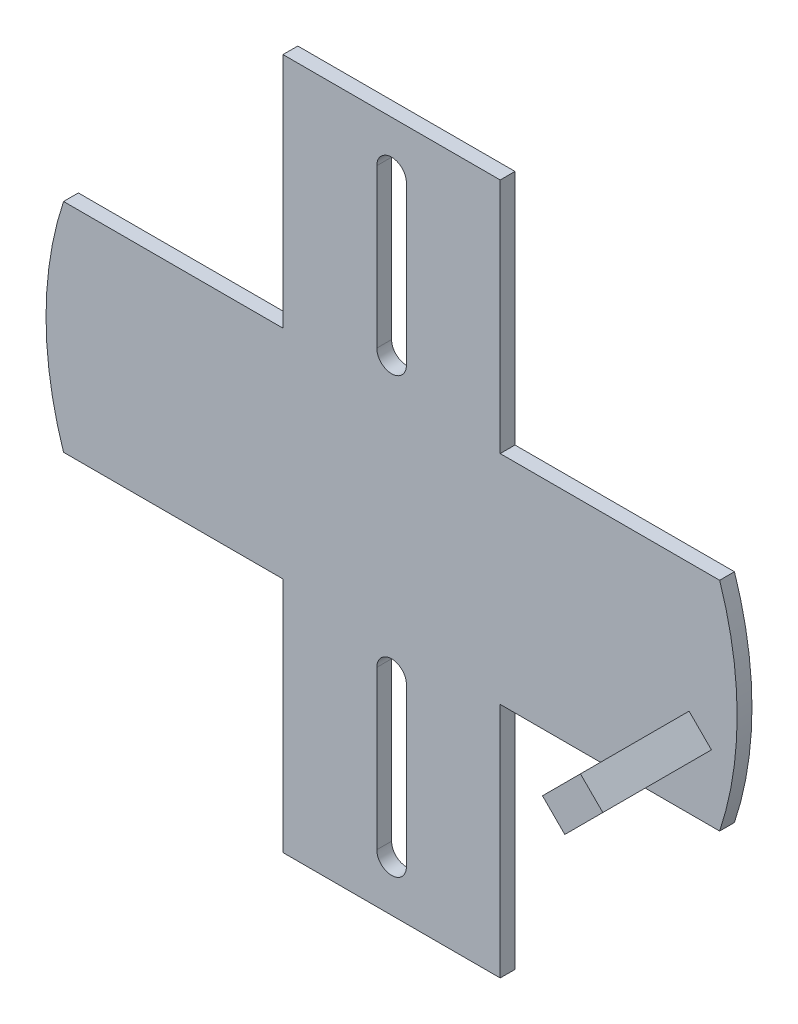
ISO-10303-21;
HEADER;
FILE_DESCRIPTION(('STEP AP214'),'2;1');
FILE_NAME('part.step','',(''),(''),'','','');
FILE_SCHEMA(('AUTOMOTIVE_DESIGN { 1 0 10303 214 1 1 1 1 }'));
ENDSEC;
DATA;
#1=APPLICATION_CONTEXT('core data for automotive mechanical design processes');
#2=APPLICATION_PROTOCOL_DEFINITION('international standard','automotive_design',2000,#1);
#3=PRODUCT_CONTEXT('',#1,'mechanical');
#4=PRODUCT('Part','Part','',(#3));
#5=PRODUCT_RELATED_PRODUCT_CATEGORY('part','',(#4));
#6=PRODUCT_DEFINITION_FORMATION('','',#4);
#7=PRODUCT_DEFINITION_CONTEXT('part definition',#1,'design');
#8=PRODUCT_DEFINITION('design','',#6,#7);
#9=PRODUCT_DEFINITION_SHAPE('','',#8);
#10=(LENGTH_UNIT() NAMED_UNIT(*) SI_UNIT(.MILLI.,.METRE.));
#11=(NAMED_UNIT(*) PLANE_ANGLE_UNIT() SI_UNIT($,.RADIAN.));
#12=(NAMED_UNIT(*) SI_UNIT($,.STERADIAN.) SOLID_ANGLE_UNIT());
#13=UNCERTAINTY_MEASURE_WITH_UNIT(LENGTH_MEASURE(1.E-05),#10,'distance_accuracy_value','');
#14=(GEOMETRIC_REPRESENTATION_CONTEXT(3) GLOBAL_UNCERTAINTY_ASSIGNED_CONTEXT((#13)) GLOBAL_UNIT_ASSIGNED_CONTEXT((#10,
#11,#12)) REPRESENTATION_CONTEXT('',''));
#15=CARTESIAN_POINT('',(0.,0.,0.));
#16=DIRECTION('',(0.,0.,1.));
#17=DIRECTION('',(1.,0.,0.));
#18=AXIS2_PLACEMENT_3D('',#15,#16,#17);
#19=CARTESIAN_POINT('',(0.,-25.,1.5));
#20=DIRECTION('',(0.,0.,-1.));
#21=DIRECTION('',(-1.,0.,0.));
#22=AXIS2_PLACEMENT_3D('',#19,#20,#21);
#23=PLANE('',#22);
#24=CARTESIAN_POINT('',(0.,-39.,1.5));
#25=DIRECTION('',(0.,0.,1.));
#26=DIRECTION('',(1.,0.,0.));
#27=AXIS2_PLACEMENT_3D('',#24,#25,#26);
#28=CIRCLE('',#27,1.5);
#29=CARTESIAN_POINT('',(1.5,-39.,1.5));
#30=VERTEX_POINT('',#29);
#31=CARTESIAN_POINT('',(-1.5,-39.,1.5));
#32=VERTEX_POINT('',#31);
#33=EDGE_CURVE('E224',#30,#32,#28,.T.);
#34=ORIENTED_EDGE('',*,*,#33,.F.);
#35=DIRECTION('',(0.,1.,0.));
#36=VECTOR('',#35,1.);
#37=CARTESIAN_POINT('',(1.5,-39.,1.5));
#38=LINE('',#37,#36);
#39=CARTESIAN_POINT('',(1.5,-55.,1.5));
#40=VERTEX_POINT('',#39);
#41=EDGE_CURVE('E232',#40,#30,#38,.T.);
#42=ORIENTED_EDGE('',*,*,#41,.F.);
#43=CARTESIAN_POINT('',(0.,-55.,1.5));
#44=DIRECTION('',(0.,0.,1.));
#45=DIRECTION('',(1.,0.,0.));
#46=AXIS2_PLACEMENT_3D('',#43,#44,#45);
#47=CIRCLE('',#46,1.5);
#48=CARTESIAN_POINT('',(-1.5,-55.,1.5));
#49=VERTEX_POINT('',#48);
#50=EDGE_CURVE('E229',#49,#40,#47,.T.);
#51=ORIENTED_EDGE('',*,*,#50,.F.);
#52=DIRECTION('',(0.,-1.,0.));
#53=VECTOR('',#52,1.);
#54=CARTESIAN_POINT('',(-1.5,-39.,1.5));
#55=LINE('',#54,#53);
#56=EDGE_CURVE('E226',#32,#49,#55,.T.);
#57=ORIENTED_EDGE('',*,*,#56,.F.);
#58=EDGE_LOOP('',(#34,#42,#51,#57));
#59=FACE_BOUND('',#58,.T.);
#60=DIRECTION('',(0.,-1.,0.));
#61=VECTOR('',#60,1.);
#62=CARTESIAN_POINT('',(-11.,-14.,1.5));
#63=LINE('',#62,#61);
#64=CARTESIAN_POINT('',(-11.,10.,1.5));
#65=VERTEX_POINT('',#64);
#66=CARTESIAN_POINT('',(-11.,-14.,1.5));
#67=VERTEX_POINT('',#66);
#68=EDGE_CURVE('E283',#65,#67,#63,.T.);
#69=ORIENTED_EDGE('',*,*,#68,.T.);
#70=DIRECTION('',(-1.,0.,0.));
#71=VECTOR('',#70,1.);
#72=CARTESIAN_POINT('',(-33.2264954516723,-14.,1.5));
#73=LINE('',#72,#71);
#74=CARTESIAN_POINT('',(-33.2264954516723,-14.,1.5));
#75=VERTEX_POINT('',#74);
#76=EDGE_CURVE('E286',#67,#75,#73,.T.);
#77=ORIENTED_EDGE('',*,*,#76,.T.);
#78=CARTESIAN_POINT('',(0.,-25.,1.5));
#79=DIRECTION('',(0.,0.,1.));
#80=DIRECTION('',(1.,0.,0.));
#81=AXIS2_PLACEMENT_3D('',#78,#79,#80);
#82=CIRCLE('',#81,35.);
#83=CARTESIAN_POINT('',(-33.2264954516723,-36.,1.5));
#84=VERTEX_POINT('',#83);
#85=EDGE_CURVE('E289',#75,#84,#82,.T.);
#86=ORIENTED_EDGE('',*,*,#85,.T.);
#87=DIRECTION('',(1.,0.,0.));
#88=VECTOR('',#87,1.);
#89=CARTESIAN_POINT('',(-11.,-36.,1.5));
#90=LINE('',#89,#88);
#91=CARTESIAN_POINT('',(-11.,-36.,1.5));
#92=VERTEX_POINT('',#91);
#93=EDGE_CURVE('E291',#84,#92,#90,.T.);
#94=ORIENTED_EDGE('',*,*,#93,.T.);
#95=DIRECTION('',(0.,-1.,0.));
#96=VECTOR('',#95,1.);
#97=CARTESIAN_POINT('',(-11.,-60.,1.5));
#98=LINE('',#97,#96);
#99=CARTESIAN_POINT('',(-11.,-60.,1.5));
#100=VERTEX_POINT('',#99);
#101=EDGE_CURVE('E293',#92,#100,#98,.T.);
#102=ORIENTED_EDGE('',*,*,#101,.T.);
#103=DIRECTION('',(1.,0.,0.));
#104=VECTOR('',#103,1.);
#105=CARTESIAN_POINT('',(11.,-60.,1.5));
#106=LINE('',#105,#104);
#107=CARTESIAN_POINT('',(11.,-60.,1.5));
#108=VERTEX_POINT('',#107);
#109=EDGE_CURVE('E295',#100,#108,#106,.T.);
#110=ORIENTED_EDGE('',*,*,#109,.T.);
#111=DIRECTION('',(0.,1.,0.));
#112=VECTOR('',#111,1.);
#113=CARTESIAN_POINT('',(11.,-36.,1.5));
#114=LINE('',#113,#112);
#115=CARTESIAN_POINT('',(11.,-36.,1.5));
#116=VERTEX_POINT('',#115);
#117=EDGE_CURVE('E297',#108,#116,#114,.T.);
#118=ORIENTED_EDGE('',*,*,#117,.T.);
#119=DIRECTION('',(1.,0.,0.));
#120=VECTOR('',#119,1.);
#121=CARTESIAN_POINT('',(33.2264954516723,-36.,1.5));
#122=LINE('',#121,#120);
#123=CARTESIAN_POINT('',(33.2264954516723,-36.,1.5));
#124=VERTEX_POINT('',#123);
#125=EDGE_CURVE('E299',#116,#124,#122,.T.);
#126=ORIENTED_EDGE('',*,*,#125,.T.);
#127=CARTESIAN_POINT('',(0.,-25.,1.5));
#128=DIRECTION('',(0.,0.,1.));
#129=DIRECTION('',(-1.,0.,0.));
#130=AXIS2_PLACEMENT_3D('',#127,#128,#129);
#131=CIRCLE('',#130,35.);
#132=CARTESIAN_POINT('',(33.2264954516723,-14.,1.5));
#133=VERTEX_POINT('',#132);
#134=EDGE_CURVE('E301',#124,#133,#131,.T.);
#135=ORIENTED_EDGE('',*,*,#134,.T.);
#136=DIRECTION('',(-1.,0.,0.));
#137=VECTOR('',#136,1.);
#138=CARTESIAN_POINT('',(11.,-14.,1.5));
#139=LINE('',#138,#137);
#140=CARTESIAN_POINT('',(11.,-14.,1.5));
#141=VERTEX_POINT('',#140);
#142=EDGE_CURVE('E303',#133,#141,#139,.T.);
#143=ORIENTED_EDGE('',*,*,#142,.T.);
#144=DIRECTION('',(0.,1.,0.));
#145=VECTOR('',#144,1.);
#146=CARTESIAN_POINT('',(11.,10.,1.5));
#147=LINE('',#146,#145);
#148=CARTESIAN_POINT('',(11.,10.,1.5));
#149=VERTEX_POINT('',#148);
#150=EDGE_CURVE('E305',#141,#149,#147,.T.);
#151=ORIENTED_EDGE('',*,*,#150,.T.);
#152=DIRECTION('',(-1.,0.,0.));
#153=VECTOR('',#152,1.);
#154=CARTESIAN_POINT('',(-11.,10.,1.5));
#155=LINE('',#154,#153);
#156=EDGE_CURVE('E307',#149,#65,#155,.T.);
#157=ORIENTED_EDGE('',*,*,#156,.T.);
#158=EDGE_LOOP('',(#69,#77,#86,#94,#102,#110,#118,#126,#135,#143,#151,#157));
#159=FACE_BOUND('',#158,.T.);
#160=CARTESIAN_POINT('',(0.,5.,1.5));
#161=DIRECTION('',(0.,0.,1.));
#162=DIRECTION('',(1.,0.,0.));
#163=AXIS2_PLACEMENT_3D('',#160,#161,#162);
#164=CIRCLE('',#163,1.49999999999999);
#165=CARTESIAN_POINT('',(1.49999999999999,5.,1.5));
#166=VERTEX_POINT('',#165);
#167=CARTESIAN_POINT('',(-1.49999999999999,5.,1.5));
#168=VERTEX_POINT('',#167);
#169=EDGE_CURVE('E252',#166,#168,#164,.T.);
#170=ORIENTED_EDGE('',*,*,#169,.F.);
#171=DIRECTION('',(0.,1.,0.));
#172=VECTOR('',#171,1.);
#173=CARTESIAN_POINT('',(1.49999999999999,5.,1.5));
#174=LINE('',#173,#172);
#175=CARTESIAN_POINT('',(1.49999999999999,-11.,1.5));
#176=VERTEX_POINT('',#175);
#177=EDGE_CURVE('E260',#176,#166,#174,.T.);
#178=ORIENTED_EDGE('',*,*,#177,.F.);
#179=CARTESIAN_POINT('',(0.,-11.,1.5));
#180=DIRECTION('',(0.,0.,1.));
#181=DIRECTION('',(1.,0.,0.));
#182=AXIS2_PLACEMENT_3D('',#179,#180,#181);
#183=CIRCLE('',#182,1.49999999999999);
#184=CARTESIAN_POINT('',(-1.5,-11.,1.5));
#185=VERTEX_POINT('',#184);
#186=EDGE_CURVE('E257',#185,#176,#183,.T.);
#187=ORIENTED_EDGE('',*,*,#186,.F.);
#188=DIRECTION('',(0.,-1.,0.));
#189=VECTOR('',#188,1.);
#190=CARTESIAN_POINT('',(-1.49999999999999,5.,1.5));
#191=LINE('',#190,#189);
#192=EDGE_CURVE('E254',#168,#185,#191,.T.);
#193=ORIENTED_EDGE('',*,*,#192,.F.);
#194=EDGE_LOOP('',(#170,#178,#187,#193));
#195=FACE_BOUND('',#194,.T.);
#196=DIRECTION('',(0.707106781186547,-0.707106781186548,0.));
#197=VECTOR('',#196,1.);
#198=CARTESIAN_POINT('',(28.5441644149849,-33.1399505714038,1.5));
#199=LINE('',#198,#197);
#200=CARTESIAN_POINT('',(26.2808853510265,-30.8766715074454,1.5));
#201=VERTEX_POINT('',#200);
#202=CARTESIAN_POINT('',(28.5441644149849,-33.1399505714038,1.5));
#203=VERTEX_POINT('',#202);
#204=EDGE_CURVE('E214',#201,#203,#199,.T.);
#205=ORIENTED_EDGE('',*,*,#204,.F.);
#206=DIRECTION('',(-0.707106781186546,-0.707106781186549,0.));
#207=VECTOR('',#206,1.);
#208=CARTESIAN_POINT('',(26.2808853510265,-30.8766715074454,1.5));
#209=LINE('',#208,#207);
#210=CARTESIAN_POINT('',(30.1295423103398,-27.0280145481321,1.5));
#211=VERTEX_POINT('',#210);
#212=EDGE_CURVE('E211',#211,#201,#209,.T.);
#213=ORIENTED_EDGE('',*,*,#212,.F.);
#214=DIRECTION('',(-0.707106781186549,0.707106781186546,0.));
#215=VECTOR('',#214,1.);
#216=CARTESIAN_POINT('',(32.3928213742982,-29.2912936120904,1.5));
#217=LINE('',#216,#215);
#218=CARTESIAN_POINT('',(32.3928213742982,-29.2912936120904,1.5));
#219=VERTEX_POINT('',#218);
#220=EDGE_CURVE('E53',#219,#211,#217,.T.);
#221=ORIENTED_EDGE('',*,*,#220,.F.);
#222=DIRECTION('',(0.707106781186548,0.707106781186547,0.));
#223=VECTOR('',#222,1.);
#224=CARTESIAN_POINT('',(28.5441644149849,-33.1399505714038,1.5));
#225=LINE('',#224,#223);
#226=EDGE_CURVE('E48',#203,#219,#225,.T.);
#227=ORIENTED_EDGE('',*,*,#226,.F.);
#228=EDGE_LOOP('',(#205,#213,#221,#227));
#229=FACE_BOUND('',#228,.T.);
#230=ADVANCED_FACE('F33',(#59,#159,#195,#229),#23,.F.);
#231=CARTESIAN_POINT('',(0.,-25.,0.));
#232=DIRECTION('',(0.,0.,-1.));
#233=DIRECTION('',(-1.,0.,0.));
#234=AXIS2_PLACEMENT_3D('',#231,#232,#233);
#235=PLANE('',#234);
#236=DIRECTION('',(0.,1.,0.));
#237=VECTOR('',#236,1.);
#238=CARTESIAN_POINT('',(1.49999999999999,5.,0.));
#239=LINE('',#238,#237);
#240=CARTESIAN_POINT('',(1.49999999999999,-11.,0.));
#241=VERTEX_POINT('',#240);
#242=CARTESIAN_POINT('',(1.49999999999999,5.,0.));
#243=VERTEX_POINT('',#242);
#244=EDGE_CURVE('E255',#241,#243,#239,.T.);
#245=ORIENTED_EDGE('',*,*,#244,.T.);
#246=CARTESIAN_POINT('',(0.,5.,0.));
#247=DIRECTION('',(0.,0.,1.));
#248=DIRECTION('',(1.,0.,0.));
#249=AXIS2_PLACEMENT_3D('',#246,#247,#248);
#250=CIRCLE('',#249,1.49999999999999);
#251=CARTESIAN_POINT('',(-1.49999999999999,5.,0.));
#252=VERTEX_POINT('',#251);
#253=EDGE_CURVE('E251',#243,#252,#250,.T.);
#254=ORIENTED_EDGE('',*,*,#253,.T.);
#255=DIRECTION('',(0.,-1.,0.));
#256=VECTOR('',#255,1.);
#257=CARTESIAN_POINT('',(-1.49999999999999,5.,0.));
#258=LINE('',#257,#256);
#259=CARTESIAN_POINT('',(-1.5,-11.,0.));
#260=VERTEX_POINT('',#259);
#261=EDGE_CURVE('E265',#252,#260,#258,.T.);
#262=ORIENTED_EDGE('',*,*,#261,.T.);
#263=CARTESIAN_POINT('',(0.,-11.,0.));
#264=DIRECTION('',(0.,0.,1.));
#265=DIRECTION('',(1.,0.,0.));
#266=AXIS2_PLACEMENT_3D('',#263,#264,#265);
#267=CIRCLE('',#266,1.49999999999999);
#268=EDGE_CURVE('E268',#260,#241,#267,.T.);
#269=ORIENTED_EDGE('',*,*,#268,.T.);
#270=EDGE_LOOP('',(#245,#254,#262,#269));
#271=FACE_BOUND('',#270,.T.);
#272=DIRECTION('',(0.,-1.,0.));
#273=VECTOR('',#272,1.);
#274=CARTESIAN_POINT('',(-11.,-14.,0.));
#275=LINE('',#274,#273);
#276=CARTESIAN_POINT('',(-11.,10.,0.));
#277=VERTEX_POINT('',#276);
#278=CARTESIAN_POINT('',(-11.,-14.,0.));
#279=VERTEX_POINT('',#278);
#280=EDGE_CURVE('E282',#277,#279,#275,.T.);
#281=ORIENTED_EDGE('',*,*,#280,.F.);
#282=DIRECTION('',(-1.,0.,0.));
#283=VECTOR('',#282,1.);
#284=CARTESIAN_POINT('',(-11.,10.,0.));
#285=LINE('',#284,#283);
#286=CARTESIAN_POINT('',(11.,10.,0.));
#287=VERTEX_POINT('',#286);
#288=EDGE_CURVE('E287',#287,#277,#285,.T.);
#289=ORIENTED_EDGE('',*,*,#288,.F.);
#290=DIRECTION('',(0.,1.,0.));
#291=VECTOR('',#290,1.);
#292=CARTESIAN_POINT('',(11.,10.,0.));
#293=LINE('',#292,#291);
#294=CARTESIAN_POINT('',(11.,-14.,0.));
#295=VERTEX_POINT('',#294);
#296=EDGE_CURVE('E330',#295,#287,#293,.T.);
#297=ORIENTED_EDGE('',*,*,#296,.F.);
#298=DIRECTION('',(-1.,0.,0.));
#299=VECTOR('',#298,1.);
#300=CARTESIAN_POINT('',(11.,-14.,0.));
#301=LINE('',#300,#299);
#302=CARTESIAN_POINT('',(33.2264954516723,-14.,0.));
#303=VERTEX_POINT('',#302);
#304=EDGE_CURVE('E328',#303,#295,#301,.T.);
#305=ORIENTED_EDGE('',*,*,#304,.F.);
#306=CARTESIAN_POINT('',(0.,-25.,0.));
#307=DIRECTION('',(0.,0.,1.));
#308=DIRECTION('',(-1.,0.,0.));
#309=AXIS2_PLACEMENT_3D('',#306,#307,#308);
#310=CIRCLE('',#309,35.);
#311=CARTESIAN_POINT('',(33.2264954516723,-36.,0.));
#312=VERTEX_POINT('',#311);
#313=EDGE_CURVE('E326',#312,#303,#310,.T.);
#314=ORIENTED_EDGE('',*,*,#313,.F.);
#315=DIRECTION('',(1.,0.,0.));
#316=VECTOR('',#315,1.);
#317=CARTESIAN_POINT('',(33.2264954516723,-36.,0.));
#318=LINE('',#317,#316);
#319=CARTESIAN_POINT('',(11.,-36.,0.));
#320=VERTEX_POINT('',#319);
#321=EDGE_CURVE('E324',#320,#312,#318,.T.);
#322=ORIENTED_EDGE('',*,*,#321,.F.);
#323=DIRECTION('',(0.,1.,0.));
#324=VECTOR('',#323,1.);
#325=CARTESIAN_POINT('',(11.,-36.,0.));
#326=LINE('',#325,#324);
#327=CARTESIAN_POINT('',(11.,-60.,0.));
#328=VERTEX_POINT('',#327);
#329=EDGE_CURVE('E322',#328,#320,#326,.T.);
#330=ORIENTED_EDGE('',*,*,#329,.F.);
#331=DIRECTION('',(1.,0.,0.));
#332=VECTOR('',#331,1.);
#333=CARTESIAN_POINT('',(11.,-60.,0.));
#334=LINE('',#333,#332);
#335=CARTESIAN_POINT('',(-11.,-60.,0.));
#336=VERTEX_POINT('',#335);
#337=EDGE_CURVE('E320',#336,#328,#334,.T.);
#338=ORIENTED_EDGE('',*,*,#337,.F.);
#339=DIRECTION('',(0.,-1.,0.));
#340=VECTOR('',#339,1.);
#341=CARTESIAN_POINT('',(-11.,-60.,0.));
#342=LINE('',#341,#340);
#343=CARTESIAN_POINT('',(-11.,-36.,0.));
#344=VERTEX_POINT('',#343);
#345=EDGE_CURVE('E318',#344,#336,#342,.T.);
#346=ORIENTED_EDGE('',*,*,#345,.F.);
#347=DIRECTION('',(1.,0.,0.));
#348=VECTOR('',#347,1.);
#349=CARTESIAN_POINT('',(-11.,-36.,0.));
#350=LINE('',#349,#348);
#351=CARTESIAN_POINT('',(-33.2264954516723,-36.,0.));
#352=VERTEX_POINT('',#351);
#353=EDGE_CURVE('E316',#352,#344,#350,.T.);
#354=ORIENTED_EDGE('',*,*,#353,.F.);
#355=CARTESIAN_POINT('',(0.,-25.,0.));
#356=DIRECTION('',(0.,0.,1.));
#357=DIRECTION('',(1.,0.,0.));
#358=AXIS2_PLACEMENT_3D('',#355,#356,#357);
#359=CIRCLE('',#358,35.);
#360=CARTESIAN_POINT('',(-33.2264954516723,-14.,0.));
#361=VERTEX_POINT('',#360);
#362=EDGE_CURVE('E314',#361,#352,#359,.T.);
#363=ORIENTED_EDGE('',*,*,#362,.F.);
#364=DIRECTION('',(-1.,0.,0.));
#365=VECTOR('',#364,1.);
#366=CARTESIAN_POINT('',(-33.2264954516723,-14.,0.));
#367=LINE('',#366,#365);
#368=EDGE_CURVE('E312',#279,#361,#367,.T.);
#369=ORIENTED_EDGE('',*,*,#368,.F.);
#370=EDGE_LOOP('',(#281,#289,#297,#305,#314,#322,#330,#338,#346,#354,#363,#369));
#371=FACE_BOUND('',#370,.T.);
#372=DIRECTION('',(0.,1.,0.));
#373=VECTOR('',#372,1.);
#374=CARTESIAN_POINT('',(1.5,-39.,0.));
#375=LINE('',#374,#373);
#376=CARTESIAN_POINT('',(1.5,-55.,0.));
#377=VERTEX_POINT('',#376);
#378=CARTESIAN_POINT('',(1.5,-39.,0.));
#379=VERTEX_POINT('',#378);
#380=EDGE_CURVE('E227',#377,#379,#375,.T.);
#381=ORIENTED_EDGE('',*,*,#380,.T.);
#382=CARTESIAN_POINT('',(0.,-39.,0.));
#383=DIRECTION('',(0.,0.,1.));
#384=DIRECTION('',(1.,0.,0.));
#385=AXIS2_PLACEMENT_3D('',#382,#383,#384);
#386=CIRCLE('',#385,1.5);
#387=CARTESIAN_POINT('',(-1.5,-39.,0.));
#388=VERTEX_POINT('',#387);
#389=EDGE_CURVE('E215',#379,#388,#386,.T.);
#390=ORIENTED_EDGE('',*,*,#389,.T.);
#391=DIRECTION('',(0.,-1.,0.));
#392=VECTOR('',#391,1.);
#393=CARTESIAN_POINT('',(-1.5,-39.,0.));
#394=LINE('',#393,#392);
#395=CARTESIAN_POINT('',(-1.5,-55.,0.));
#396=VERTEX_POINT('',#395);
#397=EDGE_CURVE('E218',#388,#396,#394,.T.);
#398=ORIENTED_EDGE('',*,*,#397,.T.);
#399=CARTESIAN_POINT('',(0.,-55.,0.));
#400=DIRECTION('',(0.,0.,1.));
#401=DIRECTION('',(1.,0.,0.));
#402=AXIS2_PLACEMENT_3D('',#399,#400,#401);
#403=CIRCLE('',#402,1.5);
#404=EDGE_CURVE('E237',#396,#377,#403,.T.);
#405=ORIENTED_EDGE('',*,*,#404,.T.);
#406=EDGE_LOOP('',(#381,#390,#398,#405));
#407=FACE_BOUND('',#406,.T.);
#408=ADVANCED_FACE('F372',(#271,#371,#407),#235,.T.);
#409=CARTESIAN_POINT('',(-11.,-14.,1.5));
#410=DIRECTION('',(1.,0.,0.));
#411=DIRECTION('',(0.,0.,-1.));
#412=AXIS2_PLACEMENT_3D('',#409,#410,#411);
#413=PLANE('',#412);
#414=ORIENTED_EDGE('',*,*,#280,.T.);
#415=DIRECTION('',(0.,0.,-1.));
#416=VECTOR('',#415,1.);
#417=CARTESIAN_POINT('',(-11.,-14.,1.5));
#418=LINE('',#417,#416);
#419=EDGE_CURVE('E11',#67,#279,#418,.T.);
#420=ORIENTED_EDGE('',*,*,#419,.F.);
#421=ORIENTED_EDGE('',*,*,#68,.F.);
#422=DIRECTION('',(0.,0.,-1.));
#423=VECTOR('',#422,1.);
#424=CARTESIAN_POINT('',(-11.,10.,1.5));
#425=LINE('',#424,#423);
#426=EDGE_CURVE('E309',#65,#277,#425,.T.);
#427=ORIENTED_EDGE('',*,*,#426,.T.);
#428=EDGE_LOOP('',(#414,#420,#421,#427));
#429=FACE_BOUND('',#428,.T.);
#430=ADVANCED_FACE('F35',(#429),#413,.F.);
#431=CARTESIAN_POINT('',(-33.2264954516723,-14.,1.5));
#432=DIRECTION('',(0.,-1.,0.));
#433=DIRECTION('',(1.,0.,0.));
#434=AXIS2_PLACEMENT_3D('',#431,#432,#433);
#435=PLANE('',#434);
#436=ORIENTED_EDGE('',*,*,#368,.T.);
#437=DIRECTION('',(0.,0.,-1.));
#438=VECTOR('',#437,1.);
#439=CARTESIAN_POINT('',(-33.2264954516723,-14.,1.5));
#440=LINE('',#439,#438);
#441=EDGE_CURVE('E41',#75,#361,#440,.T.);
#442=ORIENTED_EDGE('',*,*,#441,.F.);
#443=ORIENTED_EDGE('',*,*,#76,.F.);
#444=ORIENTED_EDGE('',*,*,#419,.T.);
#445=EDGE_LOOP('',(#436,#442,#443,#444));
#446=FACE_BOUND('',#445,.T.);
#447=ADVANCED_FACE('F390',(#446),#435,.F.);
#448=CARTESIAN_POINT('',(0.,-25.,1.5));
#449=DIRECTION('',(0.,0.,-1.));
#450=DIRECTION('',(-1.,0.,0.));
#451=AXIS2_PLACEMENT_3D('',#448,#449,#450);
#452=CYLINDRICAL_SURFACE('',#451,35.);
#453=ORIENTED_EDGE('',*,*,#362,.T.);
#454=DIRECTION('',(0.,0.,-1.));
#455=VECTOR('',#454,1.);
#456=CARTESIAN_POINT('',(-33.2264954516723,-36.,1.5));
#457=LINE('',#456,#455);
#458=EDGE_CURVE('E359',#84,#352,#457,.T.);
#459=ORIENTED_EDGE('',*,*,#458,.F.);
#460=ORIENTED_EDGE('',*,*,#85,.F.);
#461=ORIENTED_EDGE('',*,*,#441,.T.);
#462=EDGE_LOOP('',(#453,#459,#460,#461));
#463=FACE_BOUND('',#462,.T.);
#464=ADVANCED_FACE('F366',(#463),#452,.T.);
#465=CARTESIAN_POINT('',(-11.,-36.,1.5));
#466=DIRECTION('',(0.,1.,0.));
#467=DIRECTION('',(0.,0.,1.));
#468=AXIS2_PLACEMENT_3D('',#465,#466,#467);
#469=PLANE('',#468);
#470=ORIENTED_EDGE('',*,*,#353,.T.);
#471=DIRECTION('',(0.,0.,-1.));
#472=VECTOR('',#471,1.);
#473=CARTESIAN_POINT('',(-11.,-36.,1.5));
#474=LINE('',#473,#472);
#475=EDGE_CURVE('E356',#92,#344,#474,.T.);
#476=ORIENTED_EDGE('',*,*,#475,.F.);
#477=ORIENTED_EDGE('',*,*,#93,.F.);
#478=ORIENTED_EDGE('',*,*,#458,.T.);
#479=EDGE_LOOP('',(#470,#476,#477,#478));
#480=FACE_BOUND('',#479,.T.);
#481=ADVANCED_FACE('F378',(#480),#469,.F.);
#482=CARTESIAN_POINT('',(-11.,-60.,1.5));
#483=DIRECTION('',(1.,0.,0.));
#484=DIRECTION('',(0.,0.,-1.));
#485=AXIS2_PLACEMENT_3D('',#482,#483,#484);
#486=PLANE('',#485);
#487=ORIENTED_EDGE('',*,*,#345,.T.);
#488=DIRECTION('',(0.,0.,-1.));
#489=VECTOR('',#488,1.);
#490=CARTESIAN_POINT('',(-11.,-60.,1.5));
#491=LINE('',#490,#489);
#492=EDGE_CURVE('E353',#100,#336,#491,.T.);
#493=ORIENTED_EDGE('',*,*,#492,.F.);
#494=ORIENTED_EDGE('',*,*,#101,.F.);
#495=ORIENTED_EDGE('',*,*,#475,.T.);
#496=EDGE_LOOP('',(#487,#493,#494,#495));
#497=FACE_BOUND('',#496,.T.);
#498=ADVANCED_FACE('F382',(#497),#486,.F.);
#499=CARTESIAN_POINT('',(11.,-60.,1.5));
#500=DIRECTION('',(0.,1.,0.));
#501=DIRECTION('',(0.,0.,1.));
#502=AXIS2_PLACEMENT_3D('',#499,#500,#501);
#503=PLANE('',#502);
#504=ORIENTED_EDGE('',*,*,#337,.T.);
#505=DIRECTION('',(0.,0.,-1.));
#506=VECTOR('',#505,1.);
#507=CARTESIAN_POINT('',(11.,-60.,1.5));
#508=LINE('',#507,#506);
#509=EDGE_CURVE('E350',#108,#328,#508,.T.);
#510=ORIENTED_EDGE('',*,*,#509,.F.);
#511=ORIENTED_EDGE('',*,*,#109,.F.);
#512=ORIENTED_EDGE('',*,*,#492,.T.);
#513=EDGE_LOOP('',(#504,#510,#511,#512));
#514=FACE_BOUND('',#513,.T.);
#515=ADVANCED_FACE('F423',(#514),#503,.F.);
#516=CARTESIAN_POINT('',(11.,-36.,1.5));
#517=DIRECTION('',(-1.,0.,0.));
#518=DIRECTION('',(0.,-1.,0.));
#519=AXIS2_PLACEMENT_3D('',#516,#517,#518);
#520=PLANE('',#519);
#521=ORIENTED_EDGE('',*,*,#329,.T.);
#522=DIRECTION('',(0.,0.,-1.));
#523=VECTOR('',#522,1.);
#524=CARTESIAN_POINT('',(11.,-36.,1.5));
#525=LINE('',#524,#523);
#526=EDGE_CURVE('E347',#116,#320,#525,.T.);
#527=ORIENTED_EDGE('',*,*,#526,.F.);
#528=ORIENTED_EDGE('',*,*,#117,.F.);
#529=ORIENTED_EDGE('',*,*,#509,.T.);
#530=EDGE_LOOP('',(#521,#527,#528,#529));
#531=FACE_BOUND('',#530,.T.);
#532=ADVANCED_FACE('F421',(#531),#520,.F.);
#533=CARTESIAN_POINT('',(33.2264954516723,-36.,1.5));
#534=DIRECTION('',(0.,1.,0.));
#535=DIRECTION('',(-1.,0.,0.));
#536=AXIS2_PLACEMENT_3D('',#533,#534,#535);
#537=PLANE('',#536);
#538=ORIENTED_EDGE('',*,*,#321,.T.);
#539=DIRECTION('',(0.,0.,-1.));
#540=VECTOR('',#539,1.);
#541=CARTESIAN_POINT('',(33.2264954516723,-36.,1.5));
#542=LINE('',#541,#540);
#543=EDGE_CURVE('E344',#124,#312,#542,.T.);
#544=ORIENTED_EDGE('',*,*,#543,.F.);
#545=ORIENTED_EDGE('',*,*,#125,.F.);
#546=ORIENTED_EDGE('',*,*,#526,.T.);
#547=EDGE_LOOP('',(#538,#544,#545,#546));
#548=FACE_BOUND('',#547,.T.);
#549=ADVANCED_FACE('F417',(#548),#537,.F.);
#550=CARTESIAN_POINT('',(0.,-25.,1.5));
#551=DIRECTION('',(0.,0.,-1.));
#552=DIRECTION('',(-1.,0.,0.));
#553=AXIS2_PLACEMENT_3D('',#550,#551,#552);
#554=CYLINDRICAL_SURFACE('',#553,35.);
#555=ORIENTED_EDGE('',*,*,#313,.T.);
#556=DIRECTION('',(0.,0.,-1.));
#557=VECTOR('',#556,1.);
#558=CARTESIAN_POINT('',(33.2264954516723,-14.,1.5));
#559=LINE('',#558,#557);
#560=EDGE_CURVE('E341',#133,#303,#559,.T.);
#561=ORIENTED_EDGE('',*,*,#560,.F.);
#562=ORIENTED_EDGE('',*,*,#134,.F.);
#563=ORIENTED_EDGE('',*,*,#543,.T.);
#564=EDGE_LOOP('',(#555,#561,#562,#563));
#565=FACE_BOUND('',#564,.T.);
#566=ADVANCED_FACE('F412',(#565),#554,.T.);
#567=CARTESIAN_POINT('',(11.,-14.,1.5));
#568=DIRECTION('',(0.,-1.,0.));
#569=DIRECTION('',(0.,0.,-1.));
#570=AXIS2_PLACEMENT_3D('',#567,#568,#569);
#571=PLANE('',#570);
#572=ORIENTED_EDGE('',*,*,#304,.T.);
#573=DIRECTION('',(0.,0.,-1.));
#574=VECTOR('',#573,1.);
#575=CARTESIAN_POINT('',(11.,-14.,1.5));
#576=LINE('',#575,#574);
#577=EDGE_CURVE('E338',#141,#295,#576,.T.);
#578=ORIENTED_EDGE('',*,*,#577,.F.);
#579=ORIENTED_EDGE('',*,*,#142,.F.);
#580=ORIENTED_EDGE('',*,*,#560,.T.);
#581=EDGE_LOOP('',(#572,#578,#579,#580));
#582=FACE_BOUND('',#581,.T.);
#583=ADVANCED_FACE('F406',(#582),#571,.F.);
#584=CARTESIAN_POINT('',(11.,10.,1.5));
#585=DIRECTION('',(-1.,0.,0.));
#586=DIRECTION('',(0.,-1.,0.));
#587=AXIS2_PLACEMENT_3D('',#584,#585,#586);
#588=PLANE('',#587);
#589=ORIENTED_EDGE('',*,*,#296,.T.);
#590=DIRECTION('',(0.,0.,-1.));
#591=VECTOR('',#590,1.);
#592=CARTESIAN_POINT('',(11.,10.,1.5));
#593=LINE('',#592,#591);
#594=EDGE_CURVE('E335',#149,#287,#593,.T.);
#595=ORIENTED_EDGE('',*,*,#594,.F.);
#596=ORIENTED_EDGE('',*,*,#150,.F.);
#597=ORIENTED_EDGE('',*,*,#577,.T.);
#598=EDGE_LOOP('',(#589,#595,#596,#597));
#599=FACE_BOUND('',#598,.T.);
#600=ADVANCED_FACE('F402',(#599),#588,.F.);
#601=CARTESIAN_POINT('',(-11.,10.,1.5));
#602=DIRECTION('',(0.,-1.,0.));
#603=DIRECTION('',(0.,0.,-1.));
#604=AXIS2_PLACEMENT_3D('',#601,#602,#603);
#605=PLANE('',#604);
#606=ORIENTED_EDGE('',*,*,#288,.T.);
#607=ORIENTED_EDGE('',*,*,#426,.F.);
#608=ORIENTED_EDGE('',*,*,#156,.F.);
#609=ORIENTED_EDGE('',*,*,#594,.T.);
#610=EDGE_LOOP('',(#606,#607,#608,#609));
#611=FACE_BOUND('',#610,.T.);
#612=ADVANCED_FACE('F397',(#611),#605,.F.);
#613=CARTESIAN_POINT('',(0.,5.,1.5));
#614=DIRECTION('',(0.,0.,-1.));
#615=DIRECTION('',(-1.,0.,0.));
#616=AXIS2_PLACEMENT_3D('',#613,#614,#615);
#617=CYLINDRICAL_SURFACE('',#616,1.49999999999999);
#618=ORIENTED_EDGE('',*,*,#253,.F.);
#619=DIRECTION('',(0.,0.,-1.));
#620=VECTOR('',#619,1.);
#621=CARTESIAN_POINT('',(1.49999999999999,5.,1.5));
#622=LINE('',#621,#620);
#623=EDGE_CURVE('E262',#166,#243,#622,.T.);
#624=ORIENTED_EDGE('',*,*,#623,.F.);
#625=ORIENTED_EDGE('',*,*,#169,.T.);
#626=DIRECTION('',(0.,0.,-1.));
#627=VECTOR('',#626,1.);
#628=CARTESIAN_POINT('',(-1.49999999999999,5.,1.5));
#629=LINE('',#628,#627);
#630=EDGE_CURVE('E279',#168,#252,#629,.T.);
#631=ORIENTED_EDGE('',*,*,#630,.T.);
#632=EDGE_LOOP('',(#618,#624,#625,#631));
#633=FACE_BOUND('',#632,.T.);
#634=ADVANCED_FACE('F444',(#633),#617,.F.);
#635=CARTESIAN_POINT('',(-1.49999999999999,5.,1.5));
#636=DIRECTION('',(1.,0.,0.));
#637=DIRECTION('',(0.,0.,-1.));
#638=AXIS2_PLACEMENT_3D('',#635,#636,#637);
#639=PLANE('',#638);
#640=ORIENTED_EDGE('',*,*,#261,.F.);
#641=ORIENTED_EDGE('',*,*,#630,.F.);
#642=ORIENTED_EDGE('',*,*,#192,.T.);
#643=DIRECTION('',(0.,0.,-1.));
#644=VECTOR('',#643,1.);
#645=CARTESIAN_POINT('',(-1.5,-11.,1.5));
#646=LINE('',#645,#644);
#647=EDGE_CURVE('E277',#185,#260,#646,.T.);
#648=ORIENTED_EDGE('',*,*,#647,.T.);
#649=EDGE_LOOP('',(#640,#641,#642,#648));
#650=FACE_BOUND('',#649,.T.);
#651=ADVANCED_FACE('F482',(#650),#639,.T.);
#652=CARTESIAN_POINT('',(0.,-11.,1.5));
#653=DIRECTION('',(0.,0.,-1.));
#654=DIRECTION('',(-1.,0.,0.));
#655=AXIS2_PLACEMENT_3D('',#652,#653,#654);
#656=CYLINDRICAL_SURFACE('',#655,1.49999999999999);
#657=ORIENTED_EDGE('',*,*,#268,.F.);
#658=ORIENTED_EDGE('',*,*,#647,.F.);
#659=ORIENTED_EDGE('',*,*,#186,.T.);
#660=DIRECTION('',(0.,0.,-1.));
#661=VECTOR('',#660,1.);
#662=CARTESIAN_POINT('',(1.49999999999999,-11.,1.5));
#663=LINE('',#662,#661);
#664=EDGE_CURVE('E275',#176,#241,#663,.T.);
#665=ORIENTED_EDGE('',*,*,#664,.T.);
#666=EDGE_LOOP('',(#657,#658,#659,#665));
#667=FACE_BOUND('',#666,.T.);
#668=ADVANCED_FACE('F489',(#667),#656,.F.);
#669=CARTESIAN_POINT('',(1.49999999999999,5.,1.5));
#670=DIRECTION('',(-1.,0.,0.));
#671=DIRECTION('',(0.,-1.,0.));
#672=AXIS2_PLACEMENT_3D('',#669,#670,#671);
#673=PLANE('',#672);
#674=ORIENTED_EDGE('',*,*,#244,.F.);
#675=ORIENTED_EDGE('',*,*,#664,.F.);
#676=ORIENTED_EDGE('',*,*,#177,.T.);
#677=ORIENTED_EDGE('',*,*,#623,.T.);
#678=EDGE_LOOP('',(#674,#675,#676,#677));
#679=FACE_BOUND('',#678,.T.);
#680=ADVANCED_FACE('F496',(#679),#673,.T.);
#681=CARTESIAN_POINT('',(0.,-39.,1.5));
#682=DIRECTION('',(0.,0.,-1.));
#683=DIRECTION('',(-1.,0.,0.));
#684=AXIS2_PLACEMENT_3D('',#681,#682,#683);
#685=CYLINDRICAL_SURFACE('',#684,1.5);
#686=ORIENTED_EDGE('',*,*,#389,.F.);
#687=DIRECTION('',(0.,0.,-1.));
#688=VECTOR('',#687,1.);
#689=CARTESIAN_POINT('',(1.5,-39.,1.5));
#690=LINE('',#689,#688);
#691=EDGE_CURVE('E233',#30,#379,#690,.T.);
#692=ORIENTED_EDGE('',*,*,#691,.F.);
#693=ORIENTED_EDGE('',*,*,#33,.T.);
#694=DIRECTION('',(0.,0.,-1.));
#695=VECTOR('',#694,1.);
#696=CARTESIAN_POINT('',(-1.5,-39.,1.5));
#697=LINE('',#696,#695);
#698=EDGE_CURVE('E248',#32,#388,#697,.T.);
#699=ORIENTED_EDGE('',*,*,#698,.T.);
#700=EDGE_LOOP('',(#686,#692,#693,#699));
#701=FACE_BOUND('',#700,.T.);
#702=ADVANCED_FACE('F504',(#701),#685,.F.);
#703=CARTESIAN_POINT('',(-1.5,-39.,1.5));
#704=DIRECTION('',(1.,0.,0.));
#705=DIRECTION('',(0.,1.,0.));
#706=AXIS2_PLACEMENT_3D('',#703,#704,#705);
#707=PLANE('',#706);
#708=ORIENTED_EDGE('',*,*,#397,.F.);
#709=ORIENTED_EDGE('',*,*,#698,.F.);
#710=ORIENTED_EDGE('',*,*,#56,.T.);
#711=DIRECTION('',(0.,0.,-1.));
#712=VECTOR('',#711,1.);
#713=CARTESIAN_POINT('',(-1.5,-55.,1.5));
#714=LINE('',#713,#712);
#715=EDGE_CURVE('E246',#49,#396,#714,.T.);
#716=ORIENTED_EDGE('',*,*,#715,.T.);
#717=EDGE_LOOP('',(#708,#709,#710,#716));
#718=FACE_BOUND('',#717,.T.);
#719=ADVANCED_FACE('F512',(#718),#707,.T.);
#720=CARTESIAN_POINT('',(0.,-55.,1.5));
#721=DIRECTION('',(0.,0.,-1.));
#722=DIRECTION('',(-1.,0.,0.));
#723=AXIS2_PLACEMENT_3D('',#720,#721,#722);
#724=CYLINDRICAL_SURFACE('',#723,1.5);
#725=ORIENTED_EDGE('',*,*,#404,.F.);
#726=ORIENTED_EDGE('',*,*,#715,.F.);
#727=ORIENTED_EDGE('',*,*,#50,.T.);
#728=DIRECTION('',(0.,0.,-1.));
#729=VECTOR('',#728,1.);
#730=CARTESIAN_POINT('',(1.5,-55.,1.5));
#731=LINE('',#730,#729);
#732=EDGE_CURVE('E244',#40,#377,#731,.T.);
#733=ORIENTED_EDGE('',*,*,#732,.T.);
#734=EDGE_LOOP('',(#725,#726,#727,#733));
#735=FACE_BOUND('',#734,.T.);
#736=ADVANCED_FACE('F520',(#735),#724,.F.);
#737=CARTESIAN_POINT('',(1.5,-39.,1.5));
#738=DIRECTION('',(-1.,0.,0.));
#739=DIRECTION('',(0.,-1.,0.));
#740=AXIS2_PLACEMENT_3D('',#737,#738,#739);
#741=PLANE('',#740);
#742=ORIENTED_EDGE('',*,*,#380,.F.);
#743=ORIENTED_EDGE('',*,*,#732,.F.);
#744=ORIENTED_EDGE('',*,*,#41,.T.);
#745=ORIENTED_EDGE('',*,*,#691,.T.);
#746=EDGE_LOOP('',(#742,#743,#744,#745));
#747=FACE_BOUND('',#746,.T.);
#748=ADVANCED_FACE('F528',(#747),#741,.T.);
#749=CARTESIAN_POINT('',(28.5441644149849,-33.1399505714038,12.5));
#750=DIRECTION('',(0.707106781186548,0.707106781186547,0.));
#751=DIRECTION('',(-0.707106781186547,0.707106781186548,0.));
#752=AXIS2_PLACEMENT_3D('',#749,#750,#751);
#753=PLANE('',#752);
#754=ORIENTED_EDGE('',*,*,#204,.T.);
#755=DIRECTION('',(0.,0.,-1.));
#756=VECTOR('',#755,1.);
#757=CARTESIAN_POINT('',(28.5441644149849,-33.1399505714038,12.5));
#758=LINE('',#757,#756);
#759=CARTESIAN_POINT('',(28.5441644149849,-33.1399505714038,12.5));
#760=VERTEX_POINT('',#759);
#761=EDGE_CURVE('E195',#760,#203,#758,.T.);
#762=ORIENTED_EDGE('',*,*,#761,.F.);
#763=DIRECTION('',(0.707106781186547,-0.707106781186548,0.));
#764=VECTOR('',#763,1.);
#765=CARTESIAN_POINT('',(28.5441644149849,-33.1399505714038,12.5));
#766=LINE('',#765,#764);
#767=CARTESIAN_POINT('',(26.2808853510265,-30.8766715074454,12.5));
#768=VERTEX_POINT('',#767);
#769=EDGE_CURVE('E202',#768,#760,#766,.T.);
#770=ORIENTED_EDGE('',*,*,#769,.F.);
#771=DIRECTION('',(0.,0.,-1.));
#772=VECTOR('',#771,1.);
#773=CARTESIAN_POINT('',(26.2808853510265,-30.8766715074454,12.5));
#774=LINE('',#773,#772);
#775=EDGE_CURVE('E587',#768,#201,#774,.T.);
#776=ORIENTED_EDGE('',*,*,#775,.T.);
#777=EDGE_LOOP('',(#754,#762,#770,#776));
#778=FACE_BOUND('',#777,.T.);
#779=ADVANCED_FACE('F213',(#778),#753,.F.);
#780=CARTESIAN_POINT('',(28.5441644149849,-33.1399505714038,12.5));
#781=DIRECTION('',(-0.707106781186547,0.707106781186548,0.));
#782=DIRECTION('',(-0.707106781186548,-0.707106781186547,0.));
#783=AXIS2_PLACEMENT_3D('',#780,#781,#782);
#784=PLANE('',#783);
#785=ORIENTED_EDGE('',*,*,#226,.T.);
#786=DIRECTION('',(0.,0.,-1.));
#787=VECTOR('',#786,1.);
#788=CARTESIAN_POINT('',(32.3928213742982,-29.2912936120904,12.5));
#789=LINE('',#788,#787);
#790=CARTESIAN_POINT('',(32.3928213742982,-29.2912936120904,12.5));
#791=VERTEX_POINT('',#790);
#792=EDGE_CURVE('E198',#791,#219,#789,.T.);
#793=ORIENTED_EDGE('',*,*,#792,.F.);
#794=DIRECTION('',(0.707106781186548,0.707106781186547,0.));
#795=VECTOR('',#794,1.);
#796=CARTESIAN_POINT('',(28.5441644149849,-33.1399505714038,12.5));
#797=LINE('',#796,#795);
#798=EDGE_CURVE('E191',#760,#791,#797,.T.);
#799=ORIENTED_EDGE('',*,*,#798,.F.);
#800=ORIENTED_EDGE('',*,*,#761,.T.);
#801=EDGE_LOOP('',(#785,#793,#799,#800));
#802=FACE_BOUND('',#801,.T.);
#803=ADVANCED_FACE('F193',(#802),#784,.F.);
#804=CARTESIAN_POINT('',(32.3928213742982,-29.2912936120904,12.5));
#805=DIRECTION('',(-0.707106781186547,-0.707106781186549,0.));
#806=DIRECTION('',(0.707106781186549,-0.707106781186546,0.));
#807=AXIS2_PLACEMENT_3D('',#804,#805,#806);
#808=PLANE('',#807);
#809=ORIENTED_EDGE('',*,*,#220,.T.);
#810=DIRECTION('',(0.,0.,-1.));
#811=VECTOR('',#810,1.);
#812=CARTESIAN_POINT('',(30.1295423103398,-27.0280145481321,12.5));
#813=LINE('',#812,#811);
#814=CARTESIAN_POINT('',(30.1295423103398,-27.0280145481321,12.5));
#815=VERTEX_POINT('',#814);
#816=EDGE_CURVE('E220',#815,#211,#813,.T.);
#817=ORIENTED_EDGE('',*,*,#816,.F.);
#818=DIRECTION('',(-0.707106781186549,0.707106781186546,0.));
#819=VECTOR('',#818,1.);
#820=CARTESIAN_POINT('',(32.3928213742982,-29.2912936120904,12.5));
#821=LINE('',#820,#819);
#822=EDGE_CURVE('E201',#791,#815,#821,.T.);
#823=ORIENTED_EDGE('',*,*,#822,.F.);
#824=ORIENTED_EDGE('',*,*,#792,.T.);
#825=EDGE_LOOP('',(#809,#817,#823,#824));
#826=FACE_BOUND('',#825,.T.);
#827=ADVANCED_FACE('F551',(#826),#808,.F.);
#828=CARTESIAN_POINT('',(26.2808853510265,-30.8766715074454,12.5));
#829=DIRECTION('',(0.707106781186549,-0.707106781186546,0.));
#830=DIRECTION('',(0.707106781186546,0.707106781186549,0.));
#831=AXIS2_PLACEMENT_3D('',#828,#829,#830);
#832=PLANE('',#831);
#833=ORIENTED_EDGE('',*,*,#212,.T.);
#834=ORIENTED_EDGE('',*,*,#775,.F.);
#835=DIRECTION('',(-0.707106781186546,-0.707106781186549,0.));
#836=VECTOR('',#835,1.);
#837=CARTESIAN_POINT('',(26.2808853510265,-30.8766715074454,12.5));
#838=LINE('',#837,#836);
#839=EDGE_CURVE('E207',#815,#768,#838,.T.);
#840=ORIENTED_EDGE('',*,*,#839,.F.);
#841=ORIENTED_EDGE('',*,*,#816,.T.);
#842=EDGE_LOOP('',(#833,#834,#840,#841));
#843=FACE_BOUND('',#842,.T.);
#844=ADVANCED_FACE('F558',(#843),#832,.F.);
#845=CARTESIAN_POINT('',(0.,0.,12.5));
#846=DIRECTION('',(0.,0.,-1.));
#847=DIRECTION('',(-1.,0.,0.));
#848=AXIS2_PLACEMENT_3D('',#845,#846,#847);
#849=PLANE('',#848);
#850=ORIENTED_EDGE('',*,*,#769,.T.);
#851=ORIENTED_EDGE('',*,*,#798,.T.);
#852=ORIENTED_EDGE('',*,*,#822,.T.);
#853=ORIENTED_EDGE('',*,*,#839,.T.);
#854=EDGE_LOOP('',(#850,#851,#852,#853));
#855=FACE_BOUND('',#854,.T.);
#856=ADVANCED_FACE('F205',(#855),#849,.F.);
#857=CLOSED_SHELL('',(#230,#408,#430,#447,#464,#481,#498,#515,#532,#549,#566,#583,#600,#612,
#634,#651,#668,#680,#702,#719,#736,#748,#779,#803,#827,#844,#856));
#858=MANIFOLD_SOLID_BREP('B2',#857);
#859=ADVANCED_BREP_SHAPE_REPRESENTATION('',(#18,#858),#14);
#860=SHAPE_DEFINITION_REPRESENTATION(#9,#859);
ENDSEC;
END-ISO-10303-21;
